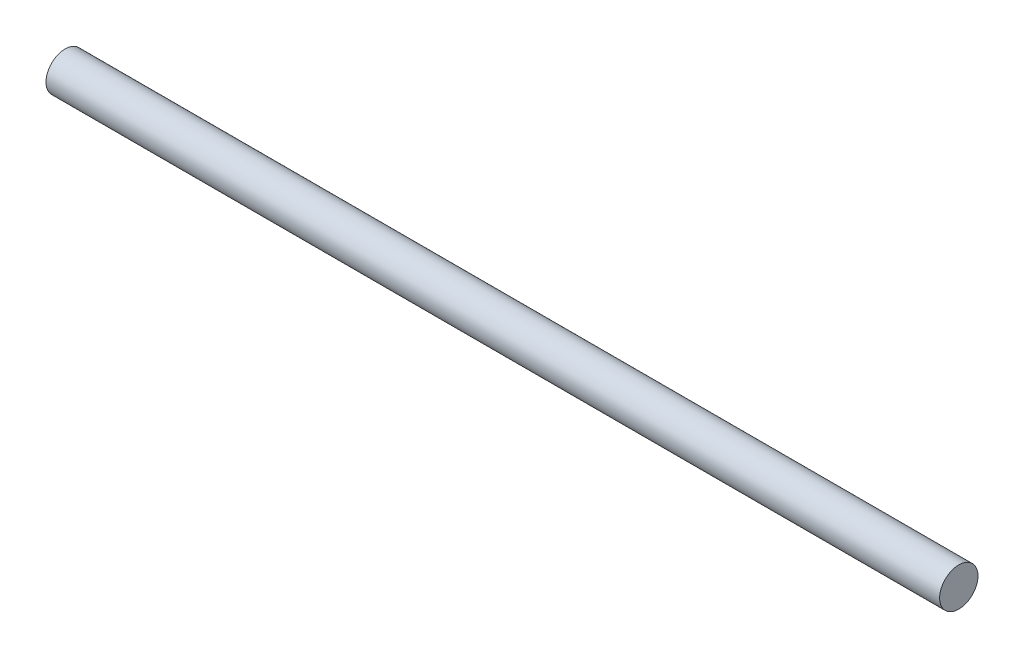
ISO-10303-21;
HEADER;
FILE_DESCRIPTION(('STEP AP214'),'2;1');
FILE_NAME('part.step','',(''),(''),'','','');
FILE_SCHEMA(('AUTOMOTIVE_DESIGN { 1 0 10303 214 1 1 1 1 }'));
ENDSEC;
DATA;
#1=APPLICATION_CONTEXT('core data for automotive mechanical design processes');
#2=APPLICATION_PROTOCOL_DEFINITION('international standard','automotive_design',2000,#1);
#3=PRODUCT_CONTEXT('',#1,'mechanical');
#4=PRODUCT('Part','Part','',(#3));
#5=PRODUCT_RELATED_PRODUCT_CATEGORY('part','',(#4));
#6=PRODUCT_DEFINITION_FORMATION('','',#4);
#7=PRODUCT_DEFINITION_CONTEXT('part definition',#1,'design');
#8=PRODUCT_DEFINITION('design','',#6,#7);
#9=PRODUCT_DEFINITION_SHAPE('','',#8);
#10=(LENGTH_UNIT() NAMED_UNIT(*) SI_UNIT(.MILLI.,.METRE.));
#11=(NAMED_UNIT(*) PLANE_ANGLE_UNIT() SI_UNIT($,.RADIAN.));
#12=(NAMED_UNIT(*) SI_UNIT($,.STERADIAN.) SOLID_ANGLE_UNIT());
#13=UNCERTAINTY_MEASURE_WITH_UNIT(LENGTH_MEASURE(1.E-05),#10,'distance_accuracy_value','');
#14=(GEOMETRIC_REPRESENTATION_CONTEXT(3) GLOBAL_UNCERTAINTY_ASSIGNED_CONTEXT((#13)) GLOBAL_UNIT_ASSIGNED_CONTEXT((#10,
#11,#12)) REPRESENTATION_CONTEXT('',''));
#15=CARTESIAN_POINT('',(0.,0.,0.));
#16=DIRECTION('',(0.,0.,1.));
#17=DIRECTION('',(1.,0.,0.));
#18=AXIS2_PLACEMENT_3D('',#15,#16,#17);
#19=CARTESIAN_POINT('',(104.775,0.,0.));
#20=DIRECTION('',(-1.,0.,0.));
#21=DIRECTION('',(0.,0.,1.));
#22=AXIS2_PLACEMENT_3D('',#19,#20,#21);
#23=CYLINDRICAL_SURFACE('',#22,2.25);
#24=CARTESIAN_POINT('',(104.775,0.,0.));
#25=DIRECTION('',(1.,0.,0.));
#26=DIRECTION('',(0.,0.,-1.));
#27=AXIS2_PLACEMENT_3D('',#24,#25,#26);
#28=CIRCLE('',#27,2.25);
#29=CARTESIAN_POINT('',(104.775,0.,-2.25));
#30=VERTEX_POINT('',#29);
#31=EDGE_CURVE('E10',#30,#30,#28,.T.);
#32=ORIENTED_EDGE('',*,*,#31,.F.);
#33=EDGE_LOOP('',(#32));
#34=FACE_BOUND('',#33,.T.);
#35=CARTESIAN_POINT('',(0.,0.,0.));
#36=DIRECTION('',(1.,0.,0.));
#37=DIRECTION('',(0.,0.,-1.));
#38=AXIS2_PLACEMENT_3D('',#35,#36,#37);
#39=CIRCLE('',#38,2.25);
#40=CARTESIAN_POINT('',(0.,0.,-2.25));
#41=VERTEX_POINT('',#40);
#42=EDGE_CURVE('E33',#41,#41,#39,.T.);
#43=ORIENTED_EDGE('',*,*,#42,.T.);
#44=EDGE_LOOP('',(#43));
#45=FACE_BOUND('',#44,.T.);
#46=ADVANCED_FACE('F30',(#34,#45),#23,.T.);
#47=CARTESIAN_POINT('',(104.775,0.,0.));
#48=DIRECTION('',(1.,0.,0.));
#49=DIRECTION('',(0.,0.,-1.));
#50=AXIS2_PLACEMENT_3D('',#47,#48,#49);
#51=PLANE('',#50);
#52=ORIENTED_EDGE('',*,*,#31,.T.);
#53=EDGE_LOOP('',(#52));
#54=FACE_BOUND('',#53,.T.);
#55=ADVANCED_FACE('F45',(#54),#51,.T.);
#56=CARTESIAN_POINT('',(0.,0.,0.));
#57=DIRECTION('',(1.,0.,0.));
#58=DIRECTION('',(0.,0.,-1.));
#59=AXIS2_PLACEMENT_3D('',#56,#57,#58);
#60=PLANE('',#59);
#61=ORIENTED_EDGE('',*,*,#42,.F.);
#62=EDGE_LOOP('',(#61));
#63=FACE_BOUND('',#62,.T.);
#64=ADVANCED_FACE('F43',(#63),#60,.F.);
#65=CLOSED_SHELL('',(#46,#55,#64));
#66=MANIFOLD_SOLID_BREP('B2',#65);
#67=ADVANCED_BREP_SHAPE_REPRESENTATION('',(#18,#66),#14);
#68=SHAPE_DEFINITION_REPRESENTATION(#9,#67);
ENDSEC;
END-ISO-10303-21;
